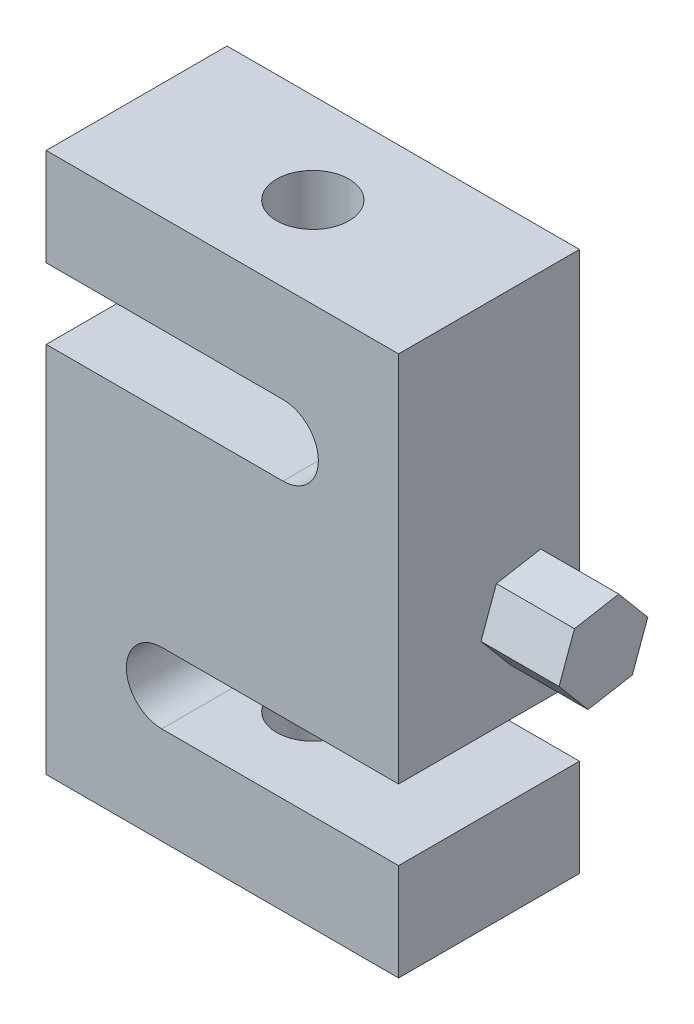
ISO-10303-21;
HEADER;
FILE_DESCRIPTION(('STEP AP214'),'2;1');
FILE_NAME('part.step','',(''),(''),'','','');
FILE_SCHEMA(('AUTOMOTIVE_DESIGN { 1 0 10303 214 1 1 1 1 }'));
ENDSEC;
DATA;
#1=APPLICATION_CONTEXT('core data for automotive mechanical design processes');
#2=APPLICATION_PROTOCOL_DEFINITION('international standard','automotive_design',2000,#1);
#3=PRODUCT_CONTEXT('',#1,'mechanical');
#4=PRODUCT('Part','Part','',(#3));
#5=PRODUCT_RELATED_PRODUCT_CATEGORY('part','',(#4));
#6=PRODUCT_DEFINITION_FORMATION('','',#4);
#7=PRODUCT_DEFINITION_CONTEXT('part definition',#1,'design');
#8=PRODUCT_DEFINITION('design','',#6,#7);
#9=PRODUCT_DEFINITION_SHAPE('','',#8);
#10=(LENGTH_UNIT() NAMED_UNIT(*) SI_UNIT(.MILLI.,.METRE.));
#11=(NAMED_UNIT(*) PLANE_ANGLE_UNIT() SI_UNIT($,.RADIAN.));
#12=(NAMED_UNIT(*) SI_UNIT($,.STERADIAN.) SOLID_ANGLE_UNIT());
#13=UNCERTAINTY_MEASURE_WITH_UNIT(LENGTH_MEASURE(1.E-05),#10,'distance_accuracy_value','');
#14=(GEOMETRIC_REPRESENTATION_CONTEXT(3) GLOBAL_UNCERTAINTY_ASSIGNED_CONTEXT((#13)) GLOBAL_UNIT_ASSIGNED_CONTEXT((#10,
#11,#12)) REPRESENTATION_CONTEXT('',''));
#15=CARTESIAN_POINT('',(0.,0.,0.));
#16=DIRECTION('',(0.,0.,1.));
#17=DIRECTION('',(1.,0.,0.));
#18=AXIS2_PLACEMENT_3D('',#15,#16,#17);
#19=CARTESIAN_POINT('',(0.,38.0873,25.4889));
#20=DIRECTION('',(0.,-1.,0.));
#21=DIRECTION('',(1.,0.,0.));
#22=AXIS2_PLACEMENT_3D('',#19,#20,#21);
#23=PLANE('',#22);
#24=DIRECTION('',(-1.,0.,0.));
#25=VECTOR('',#24,1.);
#26=CARTESIAN_POINT('',(0.,38.0873,0.));
#27=LINE('',#26,#25);
#28=CARTESIAN_POINT('',(24.8285,38.0873,0.));
#29=VERTEX_POINT('',#28);
#30=CARTESIAN_POINT('',(-24.8285,38.0873,0.));
#31=VERTEX_POINT('',#30);
#32=EDGE_CURVE('E254',#29,#31,#27,.T.);
#33=ORIENTED_EDGE('',*,*,#32,.T.);
#34=DIRECTION('',(0.,0.,-1.));
#35=VECTOR('',#34,1.);
#36=CARTESIAN_POINT('',(-24.8285,38.0873,25.4889));
#37=LINE('',#36,#35);
#38=CARTESIAN_POINT('',(-24.8285,38.0873,25.4889));
#39=VERTEX_POINT('',#38);
#40=EDGE_CURVE('E257',#39,#31,#37,.T.);
#41=ORIENTED_EDGE('',*,*,#40,.F.);
#42=DIRECTION('',(-1.,0.,0.));
#43=VECTOR('',#42,1.);
#44=CARTESIAN_POINT('',(0.,38.0873,25.4889));
#45=LINE('',#44,#43);
#46=CARTESIAN_POINT('',(24.8285,38.0873,25.4889));
#47=VERTEX_POINT('',#46);
#48=EDGE_CURVE('E227',#47,#39,#45,.T.);
#49=ORIENTED_EDGE('',*,*,#48,.F.);
#50=DIRECTION('',(0.,0.,-1.));
#51=VECTOR('',#50,1.);
#52=CARTESIAN_POINT('',(24.8285,38.0873,25.4889));
#53=LINE('',#52,#51);
#54=EDGE_CURVE('E265',#47,#29,#53,.T.);
#55=ORIENTED_EDGE('',*,*,#54,.T.);
#56=EDGE_LOOP('',(#33,#41,#49,#55));
#57=FACE_BOUND('',#56,.T.);
#58=CARTESIAN_POINT('',(0.,38.0873,12.74445));
#59=DIRECTION('',(0.,1.,0.));
#60=DIRECTION('',(0.,0.,1.));
#61=AXIS2_PLACEMENT_3D('',#58,#59,#60);
#62=CIRCLE('',#61,5.1);
#63=CARTESIAN_POINT('',(0.,38.0873,17.84445));
#64=VERTEX_POINT('',#63);
#65=EDGE_CURVE('E385',#64,#64,#62,.T.);
#66=ORIENTED_EDGE('',*,*,#65,.F.);
#67=EDGE_LOOP('',(#66));
#68=FACE_BOUND('',#67,.T.);
#69=ADVANCED_FACE('F50',(#57,#68),#23,.F.);
#70=CARTESIAN_POINT('',(24.8285,0.,25.4889));
#71=DIRECTION('',(-1.,0.,0.));
#72=DIRECTION('',(0.,0.,1.));
#73=AXIS2_PLACEMENT_3D('',#70,#71,#72);
#74=PLANE('',#73);
#75=DIRECTION('',(0.,1.,0.));
#76=VECTOR('',#75,1.);
#77=CARTESIAN_POINT('',(24.8285,0.,0.));
#78=LINE('',#77,#76);
#79=CARTESIAN_POINT('',(24.8285,-14.4145,0.));
#80=VERTEX_POINT('',#79);
#81=EDGE_CURVE('E248',#80,#29,#78,.T.);
#82=ORIENTED_EDGE('',*,*,#81,.T.);
#83=ORIENTED_EDGE('',*,*,#54,.F.);
#84=DIRECTION('',(0.,1.,0.));
#85=VECTOR('',#84,1.);
#86=CARTESIAN_POINT('',(24.8285,0.,25.4889));
#87=LINE('',#86,#85);
#88=CARTESIAN_POINT('',(24.8285,-14.4145,25.4889));
#89=VERTEX_POINT('',#88);
#90=EDGE_CURVE('E225',#89,#47,#87,.T.);
#91=ORIENTED_EDGE('',*,*,#90,.F.);
#92=DIRECTION('',(0.,0.,-1.));
#93=VECTOR('',#92,1.);
#94=CARTESIAN_POINT('',(24.8285,-14.4145,25.4889));
#95=LINE('',#94,#93);
#96=EDGE_CURVE('E264',#89,#80,#95,.T.);
#97=ORIENTED_EDGE('',*,*,#96,.T.);
#98=EDGE_LOOP('',(#82,#83,#91,#97));
#99=FACE_BOUND('',#98,.T.);
#100=DIRECTION('',(0.,-0.173422772092117,0.984847471499971));
#101=VECTOR('',#100,1.);
#102=CARTESIAN_POINT('',(24.8285,4.2520509016337,5.44680641952582));
#103=LINE('',#102,#101);
#104=CARTESIAN_POINT('',(24.8285,4.2520509016337,5.44680641952582));
#105=VERTEX_POINT('',#104);
#106=CARTESIAN_POINT('',(24.8285,3.15081629884875,11.7005878635506));
#107=VERTEX_POINT('',#106);
#108=EDGE_CURVE('E192',#105,#107,#103,.T.);
#109=ORIENTED_EDGE('',*,*,#108,.F.);
#110=DIRECTION('',(0.,0.766191543125787,0.642612261976477));
#111=VECTOR('',#110,1.);
#112=CARTESIAN_POINT('',(24.8285,-0.613265397215052,1.36621855597519));
#113=LINE('',#112,#111);
#114=CARTESIAN_POINT('',(24.8285,-0.613265397215052,1.36621855597519));
#115=VERTEX_POINT('',#114);
#116=EDGE_CURVE('E187',#115,#105,#113,.T.);
#117=ORIENTED_EDGE('',*,*,#116,.F.);
#118=DIRECTION('',(0.,0.939614315217904,-0.342235209523493));
#119=VECTOR('',#118,1.);
#120=CARTESIAN_POINT('',(24.8285,-6.57981629884874,3.53941213644937));
#121=LINE('',#120,#119);
#122=CARTESIAN_POINT('',(24.8285,-6.57981629884874,3.53941213644937));
#123=VERTEX_POINT('',#122);
#124=EDGE_CURVE('E349',#123,#115,#121,.T.);
#125=ORIENTED_EDGE('',*,*,#124,.F.);
#126=DIRECTION('',(0.,0.173422772092117,-0.984847471499971));
#127=VECTOR('',#126,1.);
#128=CARTESIAN_POINT('',(24.8285,-7.68105090163368,9.79319358047418));
#129=LINE('',#128,#127);
#130=CARTESIAN_POINT('',(24.8285,-7.68105090163368,9.79319358047418));
#131=VERTEX_POINT('',#130);
#132=EDGE_CURVE('E368',#131,#123,#129,.T.);
#133=ORIENTED_EDGE('',*,*,#132,.F.);
#134=DIRECTION('',(0.,-0.766191543125787,-0.642612261976477));
#135=VECTOR('',#134,1.);
#136=CARTESIAN_POINT('',(24.8285,-2.81573460278493,13.8737814440248));
#137=LINE('',#136,#135);
#138=CARTESIAN_POINT('',(24.8285,-2.81573460278493,13.8737814440248));
#139=VERTEX_POINT('',#138);
#140=EDGE_CURVE('E67',#139,#131,#137,.T.);
#141=ORIENTED_EDGE('',*,*,#140,.F.);
#142=DIRECTION('',(0.,-0.939614315217904,0.342235209523493));
#143=VECTOR('',#142,1.);
#144=CARTESIAN_POINT('',(24.8285,3.15081629884875,11.7005878635506));
#145=LINE('',#144,#143);
#146=EDGE_CURVE('E65',#107,#139,#145,.T.);
#147=ORIENTED_EDGE('',*,*,#146,.F.);
#148=EDGE_LOOP('',(#109,#117,#125,#133,#141,#147));
#149=FACE_BOUND('',#148,.T.);
#150=ADVANCED_FACE('F339',(#99,#149),#74,.F.);
#151=CARTESIAN_POINT('',(0.,24.3713,25.4889));
#152=DIRECTION('',(0.,1.,0.));
#153=DIRECTION('',(0.,0.,1.));
#154=AXIS2_PLACEMENT_3D('',#151,#152,#153);
#155=PLANE('',#154);
#156=CARTESIAN_POINT('',(0.,24.3713,12.74445));
#157=DIRECTION('',(0.,1.,0.));
#158=DIRECTION('',(0.,0.,1.));
#159=AXIS2_PLACEMENT_3D('',#156,#157,#158);
#160=CIRCLE('',#159,5.1);
#161=CARTESIAN_POINT('',(0.,24.3713,17.84445));
#162=VERTEX_POINT('',#161);
#163=EDGE_CURVE('E343',#162,#162,#160,.T.);
#164=ORIENTED_EDGE('',*,*,#163,.T.);
#165=EDGE_LOOP('',(#164));
#166=FACE_BOUND('',#165,.T.);
#167=DIRECTION('',(1.,0.,0.));
#168=VECTOR('',#167,1.);
#169=CARTESIAN_POINT('',(0.,24.3713,0.));
#170=LINE('',#169,#168);
#171=CARTESIAN_POINT('',(-24.8285,24.3713,0.));
#172=VERTEX_POINT('',#171);
#173=CARTESIAN_POINT('',(8.5471,24.3713,0.));
#174=VERTEX_POINT('',#173);
#175=EDGE_CURVE('E195',#172,#174,#170,.T.);
#176=ORIENTED_EDGE('',*,*,#175,.T.);
#177=DIRECTION('',(0.,0.,-1.));
#178=VECTOR('',#177,1.);
#179=CARTESIAN_POINT('',(8.5471,24.3713,25.4889));
#180=LINE('',#179,#178);
#181=CARTESIAN_POINT('',(8.5471,24.3713,25.4889));
#182=VERTEX_POINT('',#181);
#183=EDGE_CURVE('E11',#182,#174,#180,.T.);
#184=ORIENTED_EDGE('',*,*,#183,.F.);
#185=DIRECTION('',(1.,0.,0.));
#186=VECTOR('',#185,1.);
#187=CARTESIAN_POINT('',(0.,24.3713,25.4889));
#188=LINE('',#187,#186);
#189=CARTESIAN_POINT('',(-24.8285,24.3713,25.4889));
#190=VERTEX_POINT('',#189);
#191=EDGE_CURVE('E201',#190,#182,#188,.T.);
#192=ORIENTED_EDGE('',*,*,#191,.F.);
#193=DIRECTION('',(0.,0.,-1.));
#194=VECTOR('',#193,1.);
#195=CARTESIAN_POINT('',(-24.8285,24.3713,25.4889));
#196=LINE('',#195,#194);
#197=EDGE_CURVE('E256',#190,#172,#196,.T.);
#198=ORIENTED_EDGE('',*,*,#197,.T.);
#199=EDGE_LOOP('',(#176,#184,#192,#198));
#200=FACE_BOUND('',#199,.T.);
#201=ADVANCED_FACE('F47',(#166,#200),#155,.F.);
#202=CARTESIAN_POINT('',(8.5471,19.3929,25.4889));
#203=DIRECTION('',(0.,0.,-1.));
#204=DIRECTION('',(-1.,0.,0.));
#205=AXIS2_PLACEMENT_3D('',#202,#203,#204);
#206=CYLINDRICAL_SURFACE('',#205,4.9784);
#207=CARTESIAN_POINT('',(8.5471,19.3929,0.));
#208=DIRECTION('',(0.,0.,1.));
#209=DIRECTION('',(1.,0.,0.));
#210=AXIS2_PLACEMENT_3D('',#207,#208,#209);
#211=CIRCLE('',#210,4.9784);
#212=CARTESIAN_POINT('',(8.5471,14.4145,0.));
#213=VERTEX_POINT('',#212);
#214=EDGE_CURVE('E197',#174,#213,#211,.F.);
#215=ORIENTED_EDGE('',*,*,#214,.T.);
#216=DIRECTION('',(0.,0.,-1.));
#217=VECTOR('',#216,1.);
#218=CARTESIAN_POINT('',(8.5471,14.4145,25.4889));
#219=LINE('',#218,#217);
#220=CARTESIAN_POINT('',(8.5471,14.4145,25.4889));
#221=VERTEX_POINT('',#220);
#222=EDGE_CURVE('E57',#221,#213,#219,.T.);
#223=ORIENTED_EDGE('',*,*,#222,.F.);
#224=CARTESIAN_POINT('',(8.5471,19.3929,25.4889));
#225=DIRECTION('',(0.,0.,1.));
#226=DIRECTION('',(1.,0.,0.));
#227=AXIS2_PLACEMENT_3D('',#224,#225,#226);
#228=CIRCLE('',#227,4.9784);
#229=EDGE_CURVE('E206',#182,#221,#228,.F.);
#230=ORIENTED_EDGE('',*,*,#229,.F.);
#231=ORIENTED_EDGE('',*,*,#183,.T.);
#232=EDGE_LOOP('',(#215,#223,#230,#231));
#233=FACE_BOUND('',#232,.T.);
#234=ADVANCED_FACE('F288',(#233),#206,.F.);
#235=CARTESIAN_POINT('',(0.,14.4145,25.4889));
#236=DIRECTION('',(0.,1.,0.));
#237=DIRECTION('',(-1.,0.,0.));
#238=AXIS2_PLACEMENT_3D('',#235,#236,#237);
#239=PLANE('',#238);
#240=DIRECTION('',(1.,0.,0.));
#241=VECTOR('',#240,1.);
#242=CARTESIAN_POINT('',(0.,14.4145,0.));
#243=LINE('',#242,#241);
#244=CARTESIAN_POINT('',(-24.8285,14.4145,0.));
#245=VERTEX_POINT('',#244);
#246=EDGE_CURVE('E235',#245,#213,#243,.T.);
#247=ORIENTED_EDGE('',*,*,#246,.F.);
#248=DIRECTION('',(0.,0.,-1.));
#249=VECTOR('',#248,1.);
#250=CARTESIAN_POINT('',(-24.8285,14.4145,25.4889));
#251=LINE('',#250,#249);
#252=CARTESIAN_POINT('',(-24.8285,14.4145,25.4889));
#253=VERTEX_POINT('',#252);
#254=EDGE_CURVE('E279',#253,#245,#251,.T.);
#255=ORIENTED_EDGE('',*,*,#254,.F.);
#256=DIRECTION('',(1.,0.,0.));
#257=VECTOR('',#256,1.);
#258=CARTESIAN_POINT('',(0.,14.4145,25.4889));
#259=LINE('',#258,#257);
#260=EDGE_CURVE('E207',#253,#221,#259,.T.);
#261=ORIENTED_EDGE('',*,*,#260,.T.);
#262=ORIENTED_EDGE('',*,*,#222,.T.);
#263=EDGE_LOOP('',(#247,#255,#261,#262));
#264=FACE_BOUND('',#263,.T.);
#265=ADVANCED_FACE('F285',(#264),#239,.T.);
#266=CARTESIAN_POINT('',(-24.8285,0.,25.4889));
#267=DIRECTION('',(-1.,0.,0.));
#268=DIRECTION('',(0.,0.,1.));
#269=AXIS2_PLACEMENT_3D('',#266,#267,#268);
#270=PLANE('',#269);
#271=DIRECTION('',(0.,1.,0.));
#272=VECTOR('',#271,1.);
#273=CARTESIAN_POINT('',(-24.8285,0.,0.));
#274=LINE('',#273,#272);
#275=CARTESIAN_POINT('',(-24.8285,-38.0873,0.));
#276=VERTEX_POINT('',#275);
#277=EDGE_CURVE('E240',#276,#245,#274,.T.);
#278=ORIENTED_EDGE('',*,*,#277,.F.);
#279=DIRECTION('',(0.,0.,-1.));
#280=VECTOR('',#279,1.);
#281=CARTESIAN_POINT('',(-24.8285,-38.0873,25.4889));
#282=LINE('',#281,#280);
#283=CARTESIAN_POINT('',(-24.8285,-38.0873,25.4889));
#284=VERTEX_POINT('',#283);
#285=EDGE_CURVE('E277',#284,#276,#282,.T.);
#286=ORIENTED_EDGE('',*,*,#285,.F.);
#287=DIRECTION('',(0.,1.,0.));
#288=VECTOR('',#287,1.);
#289=CARTESIAN_POINT('',(-24.8285,0.,25.4889));
#290=LINE('',#289,#288);
#291=EDGE_CURVE('E215',#284,#253,#290,.T.);
#292=ORIENTED_EDGE('',*,*,#291,.T.);
#293=ORIENTED_EDGE('',*,*,#254,.T.);
#294=EDGE_LOOP('',(#278,#286,#292,#293));
#295=FACE_BOUND('',#294,.T.);
#296=ADVANCED_FACE('F293',(#295),#270,.T.);
#297=CARTESIAN_POINT('',(0.,-38.0873,25.4889));
#298=DIRECTION('',(0.,-1.,0.));
#299=DIRECTION('',(1.,0.,0.));
#300=AXIS2_PLACEMENT_3D('',#297,#298,#299);
#301=PLANE('',#300);
#302=CARTESIAN_POINT('',(0.,-38.0873,12.74445));
#303=DIRECTION('',(0.,-1.,0.));
#304=DIRECTION('',(0.,0.,-1.));
#305=AXIS2_PLACEMENT_3D('',#302,#303,#304);
#306=CIRCLE('',#305,5.1);
#307=CARTESIAN_POINT('',(0.,-38.0873,7.64445000000001));
#308=VERTEX_POINT('',#307);
#309=EDGE_CURVE('E384',#308,#308,#306,.T.);
#310=ORIENTED_EDGE('',*,*,#309,.F.);
#311=EDGE_LOOP('',(#310));
#312=FACE_BOUND('',#311,.T.);
#313=DIRECTION('',(-1.,0.,0.));
#314=VECTOR('',#313,1.);
#315=CARTESIAN_POINT('',(0.,-38.0873,0.));
#316=LINE('',#315,#314);
#317=CARTESIAN_POINT('',(24.8285,-38.0873,0.));
#318=VERTEX_POINT('',#317);
#319=EDGE_CURVE('E238',#318,#276,#316,.T.);
#320=ORIENTED_EDGE('',*,*,#319,.F.);
#321=DIRECTION('',(0.,0.,-1.));
#322=VECTOR('',#321,1.);
#323=CARTESIAN_POINT('',(24.8285,-38.0873,25.4889));
#324=LINE('',#323,#322);
#325=CARTESIAN_POINT('',(24.8285,-38.0873,25.4889));
#326=VERTEX_POINT('',#325);
#327=EDGE_CURVE('E273',#326,#318,#324,.T.);
#328=ORIENTED_EDGE('',*,*,#327,.F.);
#329=DIRECTION('',(-1.,0.,0.));
#330=VECTOR('',#329,1.);
#331=CARTESIAN_POINT('',(0.,-38.0873,25.4889));
#332=LINE('',#331,#330);
#333=EDGE_CURVE('E214',#326,#284,#332,.T.);
#334=ORIENTED_EDGE('',*,*,#333,.T.);
#335=ORIENTED_EDGE('',*,*,#285,.T.);
#336=EDGE_LOOP('',(#320,#328,#334,#335));
#337=FACE_BOUND('',#336,.T.);
#338=ADVANCED_FACE('F333',(#312,#337),#301,.T.);
#339=CARTESIAN_POINT('',(24.8285,-24.3713,0.));
#340=VERTEX_POINT('',#339);
#341=EDGE_CURVE('E245',#318,#340,#78,.T.);
#342=ORIENTED_EDGE('',*,*,#341,.T.);
#343=DIRECTION('',(0.,0.,-1.));
#344=VECTOR('',#343,1.);
#345=CARTESIAN_POINT('',(24.8285,-24.3713,25.4889));
#346=LINE('',#345,#344);
#347=CARTESIAN_POINT('',(24.8285,-24.3713,25.4889));
#348=VERTEX_POINT('',#347);
#349=EDGE_CURVE('E271',#348,#340,#346,.T.);
#350=ORIENTED_EDGE('',*,*,#349,.F.);
#351=EDGE_CURVE('E218',#326,#348,#87,.T.);
#352=ORIENTED_EDGE('',*,*,#351,.F.);
#353=ORIENTED_EDGE('',*,*,#327,.T.);
#354=EDGE_LOOP('',(#342,#350,#352,#353));
#355=FACE_BOUND('',#354,.T.);
#356=ADVANCED_FACE('F334',(#355),#74,.F.);
#357=CARTESIAN_POINT('',(0.,-24.3713,25.4889));
#358=DIRECTION('',(0.,-1.,0.));
#359=DIRECTION('',(1.,0.,0.));
#360=AXIS2_PLACEMENT_3D('',#357,#358,#359);
#361=PLANE('',#360);
#362=CARTESIAN_POINT('',(0.,-24.3713,12.74445));
#363=DIRECTION('',(0.,-1.,0.));
#364=DIRECTION('',(1.,0.,0.));
#365=AXIS2_PLACEMENT_3D('',#362,#363,#364);
#366=CIRCLE('',#365,5.1);
#367=CARTESIAN_POINT('',(5.1,-24.3713,12.74445));
#368=VERTEX_POINT('',#367);
#369=EDGE_CURVE('E51',#368,#368,#366,.T.);
#370=ORIENTED_EDGE('',*,*,#369,.T.);
#371=EDGE_LOOP('',(#370));
#372=FACE_BOUND('',#371,.T.);
#373=DIRECTION('',(-1.,0.,0.));
#374=VECTOR('',#373,1.);
#375=CARTESIAN_POINT('',(0.,-24.3713,0.));
#376=LINE('',#375,#374);
#377=CARTESIAN_POINT('',(-8.5471,-24.3713,0.));
#378=VERTEX_POINT('',#377);
#379=EDGE_CURVE('E242',#340,#378,#376,.T.);
#380=ORIENTED_EDGE('',*,*,#379,.T.);
#381=DIRECTION('',(0.,0.,-1.));
#382=VECTOR('',#381,1.);
#383=CARTESIAN_POINT('',(-8.5471,-24.3713,25.4889));
#384=LINE('',#383,#382);
#385=CARTESIAN_POINT('',(-8.5471,-24.3713,25.4889));
#386=VERTEX_POINT('',#385);
#387=EDGE_CURVE('E267',#386,#378,#384,.T.);
#388=ORIENTED_EDGE('',*,*,#387,.F.);
#389=DIRECTION('',(-1.,0.,0.));
#390=VECTOR('',#389,1.);
#391=CARTESIAN_POINT('',(0.,-24.3713,25.4889));
#392=LINE('',#391,#390);
#393=EDGE_CURVE('E222',#348,#386,#392,.T.);
#394=ORIENTED_EDGE('',*,*,#393,.F.);
#395=ORIENTED_EDGE('',*,*,#349,.T.);
#396=EDGE_LOOP('',(#380,#388,#394,#395));
#397=FACE_BOUND('',#396,.T.);
#398=ADVANCED_FACE('F327',(#372,#397),#361,.F.);
#399=CARTESIAN_POINT('',(-8.5471,-19.3929,25.4889));
#400=DIRECTION('',(0.,0.,-1.));
#401=DIRECTION('',(-1.,0.,0.));
#402=AXIS2_PLACEMENT_3D('',#399,#400,#401);
#403=CYLINDRICAL_SURFACE('',#402,4.9784);
#404=CARTESIAN_POINT('',(-8.5471,-19.3929,0.));
#405=DIRECTION('',(0.,0.,1.));
#406=DIRECTION('',(1.,0.,0.));
#407=AXIS2_PLACEMENT_3D('',#404,#405,#406);
#408=CIRCLE('',#407,4.9784);
#409=CARTESIAN_POINT('',(-8.5471,-14.4145,0.));
#410=VERTEX_POINT('',#409);
#411=EDGE_CURVE('E250',#410,#378,#408,.T.);
#412=ORIENTED_EDGE('',*,*,#411,.F.);
#413=DIRECTION('',(0.,0.,-1.));
#414=VECTOR('',#413,1.);
#415=CARTESIAN_POINT('',(-8.5471,-14.4145,25.4889));
#416=LINE('',#415,#414);
#417=CARTESIAN_POINT('',(-8.5471,-14.4145,25.4889));
#418=VERTEX_POINT('',#417);
#419=EDGE_CURVE('E270',#418,#410,#416,.T.);
#420=ORIENTED_EDGE('',*,*,#419,.F.);
#421=CARTESIAN_POINT('',(-8.5471,-19.3929,25.4889));
#422=DIRECTION('',(0.,0.,1.));
#423=DIRECTION('',(1.,0.,0.));
#424=AXIS2_PLACEMENT_3D('',#421,#422,#423);
#425=CIRCLE('',#424,4.9784);
#426=EDGE_CURVE('E221',#418,#386,#425,.T.);
#427=ORIENTED_EDGE('',*,*,#426,.T.);
#428=ORIENTED_EDGE('',*,*,#387,.T.);
#429=EDGE_LOOP('',(#412,#420,#427,#428));
#430=FACE_BOUND('',#429,.T.);
#431=ADVANCED_FACE('F322',(#430),#403,.F.);
#432=CARTESIAN_POINT('',(0.,-14.4145,25.4889));
#433=DIRECTION('',(0.,-1.,0.));
#434=DIRECTION('',(1.,0.,0.));
#435=AXIS2_PLACEMENT_3D('',#432,#433,#434);
#436=PLANE('',#435);
#437=DIRECTION('',(-1.,0.,0.));
#438=VECTOR('',#437,1.);
#439=CARTESIAN_POINT('',(0.,-14.4145,0.));
#440=LINE('',#439,#438);
#441=EDGE_CURVE('E252',#80,#410,#440,.T.);
#442=ORIENTED_EDGE('',*,*,#441,.F.);
#443=ORIENTED_EDGE('',*,*,#96,.F.);
#444=DIRECTION('',(-1.,0.,0.));
#445=VECTOR('',#444,1.);
#446=CARTESIAN_POINT('',(0.,-14.4145,25.4889));
#447=LINE('',#446,#445);
#448=EDGE_CURVE('E226',#89,#418,#447,.T.);
#449=ORIENTED_EDGE('',*,*,#448,.T.);
#450=ORIENTED_EDGE('',*,*,#419,.T.);
#451=EDGE_LOOP('',(#442,#443,#449,#450));
#452=FACE_BOUND('',#451,.T.);
#453=ADVANCED_FACE('F318',(#452),#436,.T.);
#454=EDGE_CURVE('E210',#172,#31,#274,.T.);
#455=ORIENTED_EDGE('',*,*,#454,.F.);
#456=ORIENTED_EDGE('',*,*,#197,.F.);
#457=EDGE_CURVE('E216',#190,#39,#290,.T.);
#458=ORIENTED_EDGE('',*,*,#457,.T.);
#459=ORIENTED_EDGE('',*,*,#40,.T.);
#460=EDGE_LOOP('',(#455,#456,#458,#459));
#461=FACE_BOUND('',#460,.T.);
#462=ADVANCED_FACE('F306',(#461),#270,.T.);
#463=CARTESIAN_POINT('',(0.,0.,25.4889));
#464=DIRECTION('',(0.,0.,1.));
#465=DIRECTION('',(1.,0.,0.));
#466=AXIS2_PLACEMENT_3D('',#463,#464,#465);
#467=PLANE('',#466);
#468=ORIENTED_EDGE('',*,*,#191,.T.);
#469=ORIENTED_EDGE('',*,*,#229,.T.);
#470=ORIENTED_EDGE('',*,*,#260,.F.);
#471=ORIENTED_EDGE('',*,*,#291,.F.);
#472=ORIENTED_EDGE('',*,*,#333,.F.);
#473=ORIENTED_EDGE('',*,*,#351,.T.);
#474=ORIENTED_EDGE('',*,*,#393,.T.);
#475=ORIENTED_EDGE('',*,*,#426,.F.);
#476=ORIENTED_EDGE('',*,*,#448,.F.);
#477=ORIENTED_EDGE('',*,*,#90,.T.);
#478=ORIENTED_EDGE('',*,*,#48,.T.);
#479=ORIENTED_EDGE('',*,*,#457,.F.);
#480=EDGE_LOOP('',(#468,#469,#470,#471,#472,#473,#474,#475,#476,#477,#478,#479));
#481=FACE_BOUND('',#480,.T.);
#482=ADVANCED_FACE('F300',(#481),#467,.T.);
#483=CARTESIAN_POINT('',(0.,0.,0.));
#484=DIRECTION('',(0.,0.,1.));
#485=DIRECTION('',(1.,0.,0.));
#486=AXIS2_PLACEMENT_3D('',#483,#484,#485);
#487=PLANE('',#486);
#488=ORIENTED_EDGE('',*,*,#175,.F.);
#489=ORIENTED_EDGE('',*,*,#454,.T.);
#490=ORIENTED_EDGE('',*,*,#32,.F.);
#491=ORIENTED_EDGE('',*,*,#81,.F.);
#492=ORIENTED_EDGE('',*,*,#441,.T.);
#493=ORIENTED_EDGE('',*,*,#411,.T.);
#494=ORIENTED_EDGE('',*,*,#379,.F.);
#495=ORIENTED_EDGE('',*,*,#341,.F.);
#496=ORIENTED_EDGE('',*,*,#319,.T.);
#497=ORIENTED_EDGE('',*,*,#277,.T.);
#498=ORIENTED_EDGE('',*,*,#246,.T.);
#499=ORIENTED_EDGE('',*,*,#214,.F.);
#500=EDGE_LOOP('',(#488,#489,#490,#491,#492,#493,#494,#495,#496,#497,#498,#499));
#501=FACE_BOUND('',#500,.T.);
#502=ADVANCED_FACE('F286',(#501),#487,.F.);
#503=CARTESIAN_POINT('',(35.8267,4.2520509016337,5.44680641952582));
#504=DIRECTION('',(0.,-0.984847471499971,-0.173422772092117));
#505=DIRECTION('',(0.,0.173422772092117,-0.984847471499971));
#506=AXIS2_PLACEMENT_3D('',#503,#504,#505);
#507=PLANE('',#506);
#508=ORIENTED_EDGE('',*,*,#108,.T.);
#509=DIRECTION('',(-1.,0.,0.));
#510=VECTOR('',#509,1.);
#511=CARTESIAN_POINT('',(35.8267,3.15081629884875,11.7005878635506));
#512=LINE('',#511,#510);
#513=CARTESIAN_POINT('',(35.8267,3.15081629884875,11.7005878635506));
#514=VERTEX_POINT('',#513);
#515=EDGE_CURVE('E173',#514,#107,#512,.T.);
#516=ORIENTED_EDGE('',*,*,#515,.F.);
#517=DIRECTION('',(0.,-0.173422772092117,0.984847471499971));
#518=VECTOR('',#517,1.);
#519=CARTESIAN_POINT('',(35.8267,4.2520509016337,5.44680641952582));
#520=LINE('',#519,#518);
#521=CARTESIAN_POINT('',(35.8267,4.2520509016337,5.44680641952582));
#522=VERTEX_POINT('',#521);
#523=EDGE_CURVE('E182',#522,#514,#520,.T.);
#524=ORIENTED_EDGE('',*,*,#523,.F.);
#525=DIRECTION('',(-1.,0.,0.));
#526=VECTOR('',#525,1.);
#527=CARTESIAN_POINT('',(35.8267,4.2520509016337,5.44680641952582));
#528=LINE('',#527,#526);
#529=EDGE_CURVE('E347',#522,#105,#528,.T.);
#530=ORIENTED_EDGE('',*,*,#529,.T.);
#531=EDGE_LOOP('',(#508,#516,#524,#530));
#532=FACE_BOUND('',#531,.T.);
#533=ADVANCED_FACE('F194',(#532),#507,.F.);
#534=CARTESIAN_POINT('',(35.8267,3.15081629884875,11.7005878635506));
#535=DIRECTION('',(0.,-0.342235209523493,-0.939614315217904));
#536=DIRECTION('',(0.,0.939614315217904,-0.342235209523493));
#537=AXIS2_PLACEMENT_3D('',#534,#535,#536);
#538=PLANE('',#537);
#539=ORIENTED_EDGE('',*,*,#146,.T.);
#540=DIRECTION('',(-1.,0.,0.));
#541=VECTOR('',#540,1.);
#542=CARTESIAN_POINT('',(35.8267,-2.81573460278493,13.8737814440248));
#543=LINE('',#542,#541);
#544=CARTESIAN_POINT('',(35.8267,-2.81573460278493,13.8737814440248));
#545=VERTEX_POINT('',#544);
#546=EDGE_CURVE('E179',#545,#139,#543,.T.);
#547=ORIENTED_EDGE('',*,*,#546,.F.);
#548=DIRECTION('',(0.,-0.939614315217904,0.342235209523493));
#549=VECTOR('',#548,1.);
#550=CARTESIAN_POINT('',(35.8267,3.15081629884875,11.7005878635506));
#551=LINE('',#550,#549);
#552=EDGE_CURVE('E168',#514,#545,#551,.T.);
#553=ORIENTED_EDGE('',*,*,#552,.F.);
#554=ORIENTED_EDGE('',*,*,#515,.T.);
#555=EDGE_LOOP('',(#539,#547,#553,#554));
#556=FACE_BOUND('',#555,.T.);
#557=ADVANCED_FACE('F171',(#556),#538,.F.);
#558=CARTESIAN_POINT('',(35.8267,-2.81573460278493,13.8737814440248));
#559=DIRECTION('',(0.,0.642612261976478,-0.766191543125787));
#560=DIRECTION('',(0.,0.766191543125787,0.642612261976478));
#561=AXIS2_PLACEMENT_3D('',#558,#559,#560);
#562=PLANE('',#561);
#563=ORIENTED_EDGE('',*,*,#140,.T.);
#564=DIRECTION('',(-1.,0.,0.));
#565=VECTOR('',#564,1.);
#566=CARTESIAN_POINT('',(35.8267,-7.68105090163368,9.79319358047418));
#567=LINE('',#566,#565);
#568=CARTESIAN_POINT('',(35.8267,-7.68105090163368,9.79319358047418));
#569=VERTEX_POINT('',#568);
#570=EDGE_CURVE('E200',#569,#131,#567,.T.);
#571=ORIENTED_EDGE('',*,*,#570,.F.);
#572=DIRECTION('',(0.,-0.766191543125787,-0.642612261976477));
#573=VECTOR('',#572,1.);
#574=CARTESIAN_POINT('',(35.8267,-2.81573460278493,13.8737814440248));
#575=LINE('',#574,#573);
#576=EDGE_CURVE('E176',#545,#569,#575,.T.);
#577=ORIENTED_EDGE('',*,*,#576,.F.);
#578=ORIENTED_EDGE('',*,*,#546,.T.);
#579=EDGE_LOOP('',(#563,#571,#577,#578));
#580=FACE_BOUND('',#579,.T.);
#581=ADVANCED_FACE('F369',(#580),#562,.F.);
#582=CARTESIAN_POINT('',(35.8267,-7.68105090163368,9.79319358047418));
#583=DIRECTION('',(0.,0.984847471499971,0.173422772092117));
#584=DIRECTION('',(0.,-0.173422772092117,0.984847471499971));
#585=AXIS2_PLACEMENT_3D('',#582,#583,#584);
#586=PLANE('',#585);
#587=ORIENTED_EDGE('',*,*,#132,.T.);
#588=DIRECTION('',(-1.,0.,0.));
#589=VECTOR('',#588,1.);
#590=CARTESIAN_POINT('',(35.8267,-6.57981629884874,3.53941213644937));
#591=LINE('',#590,#589);
#592=CARTESIAN_POINT('',(35.8267,-6.57981629884874,3.53941213644937));
#593=VERTEX_POINT('',#592);
#594=EDGE_CURVE('E351',#593,#123,#591,.T.);
#595=ORIENTED_EDGE('',*,*,#594,.F.);
#596=DIRECTION('',(0.,0.173422772092117,-0.984847471499971));
#597=VECTOR('',#596,1.);
#598=CARTESIAN_POINT('',(35.8267,-7.68105090163368,9.79319358047418));
#599=LINE('',#598,#597);
#600=EDGE_CURVE('E370',#569,#593,#599,.T.);
#601=ORIENTED_EDGE('',*,*,#600,.F.);
#602=ORIENTED_EDGE('',*,*,#570,.T.);
#603=EDGE_LOOP('',(#587,#595,#601,#602));
#604=FACE_BOUND('',#603,.T.);
#605=ADVANCED_FACE('F365',(#604),#586,.F.);
#606=CARTESIAN_POINT('',(35.8267,-6.57981629884874,3.53941213644937));
#607=DIRECTION('',(0.,0.342235209523493,0.939614315217904));
#608=DIRECTION('',(0.,-0.939614315217904,0.342235209523493));
#609=AXIS2_PLACEMENT_3D('',#606,#607,#608);
#610=PLANE('',#609);
#611=ORIENTED_EDGE('',*,*,#124,.T.);
#612=DIRECTION('',(-1.,0.,0.));
#613=VECTOR('',#612,1.);
#614=CARTESIAN_POINT('',(35.8267,-0.613265397215052,1.36621855597519));
#615=LINE('',#614,#613);
#616=CARTESIAN_POINT('',(35.8267,-0.613265397215052,1.36621855597519));
#617=VERTEX_POINT('',#616);
#618=EDGE_CURVE('E346',#617,#115,#615,.T.);
#619=ORIENTED_EDGE('',*,*,#618,.F.);
#620=DIRECTION('',(0.,0.939614315217904,-0.342235209523493));
#621=VECTOR('',#620,1.);
#622=CARTESIAN_POINT('',(35.8267,-6.57981629884874,3.53941213644937));
#623=LINE('',#622,#621);
#624=EDGE_CURVE('E353',#593,#617,#623,.T.);
#625=ORIENTED_EDGE('',*,*,#624,.F.);
#626=ORIENTED_EDGE('',*,*,#594,.T.);
#627=EDGE_LOOP('',(#611,#619,#625,#626));
#628=FACE_BOUND('',#627,.T.);
#629=ADVANCED_FACE('F372',(#628),#610,.F.);
#630=CARTESIAN_POINT('',(35.8267,-0.613265397215052,1.36621855597519));
#631=DIRECTION('',(0.,-0.642612261976478,0.766191543125787));
#632=DIRECTION('',(0.,-0.766191543125787,-0.642612261976478));
#633=AXIS2_PLACEMENT_3D('',#630,#631,#632);
#634=PLANE('',#633);
#635=ORIENTED_EDGE('',*,*,#116,.T.);
#636=ORIENTED_EDGE('',*,*,#529,.F.);
#637=DIRECTION('',(0.,0.766191543125787,0.642612261976477));
#638=VECTOR('',#637,1.);
#639=CARTESIAN_POINT('',(35.8267,-0.613265397215052,1.36621855597519));
#640=LINE('',#639,#638);
#641=EDGE_CURVE('E189',#617,#522,#640,.T.);
#642=ORIENTED_EDGE('',*,*,#641,.F.);
#643=ORIENTED_EDGE('',*,*,#618,.T.);
#644=EDGE_LOOP('',(#635,#636,#642,#643));
#645=FACE_BOUND('',#644,.T.);
#646=ADVANCED_FACE('F341',(#645),#634,.F.);
#647=CARTESIAN_POINT('',(35.8267,0.,0.));
#648=DIRECTION('',(1.,0.,0.));
#649=DIRECTION('',(0.,0.,-1.));
#650=AXIS2_PLACEMENT_3D('',#647,#648,#649);
#651=PLANE('',#650);
#652=ORIENTED_EDGE('',*,*,#523,.T.);
#653=ORIENTED_EDGE('',*,*,#552,.T.);
#654=ORIENTED_EDGE('',*,*,#576,.T.);
#655=ORIENTED_EDGE('',*,*,#600,.T.);
#656=ORIENTED_EDGE('',*,*,#624,.T.);
#657=ORIENTED_EDGE('',*,*,#641,.T.);
#658=EDGE_LOOP('',(#652,#653,#654,#655,#656,#657));
#659=FACE_BOUND('',#658,.T.);
#660=ADVANCED_FACE('F184',(#659),#651,.T.);
#661=CARTESIAN_POINT('',(0.,38.0873,12.74445));
#662=DIRECTION('',(0.,1.,0.));
#663=DIRECTION('',(0.,0.,1.));
#664=AXIS2_PLACEMENT_3D('',#661,#662,#663);
#665=CYLINDRICAL_SURFACE('',#664,5.1);
#666=ORIENTED_EDGE('',*,*,#65,.T.);
#667=EDGE_LOOP('',(#666));
#668=FACE_BOUND('',#667,.T.);
#669=ORIENTED_EDGE('',*,*,#163,.F.);
#670=EDGE_LOOP('',(#669));
#671=FACE_BOUND('',#670,.T.);
#672=ADVANCED_FACE('F392',(#668,#671),#665,.F.);
#673=CARTESIAN_POINT('',(0.,-38.0873,12.74445));
#674=DIRECTION('',(0.,-1.,0.));
#675=DIRECTION('',(0.,0.,-1.));
#676=AXIS2_PLACEMENT_3D('',#673,#674,#675);
#677=CYLINDRICAL_SURFACE('',#676,5.1);
#678=ORIENTED_EDGE('',*,*,#309,.T.);
#679=EDGE_LOOP('',(#678));
#680=FACE_BOUND('',#679,.T.);
#681=ORIENTED_EDGE('',*,*,#369,.F.);
#682=EDGE_LOOP('',(#681));
#683=FACE_BOUND('',#682,.T.);
#684=ADVANCED_FACE('F395',(#680,#683),#677,.F.);
#685=CLOSED_SHELL('',(#69,#150,#201,#234,#265,#296,#338,#356,#398,#431,#453,#462,#482,#502,#533,
#557,#581,#605,#629,#646,#660,#672,#684));
#686=MANIFOLD_SOLID_BREP('B2',#685);
#687=ADVANCED_BREP_SHAPE_REPRESENTATION('',(#18,#686),#14);
#688=SHAPE_DEFINITION_REPRESENTATION(#9,#687);
ENDSEC;
END-ISO-10303-21;
